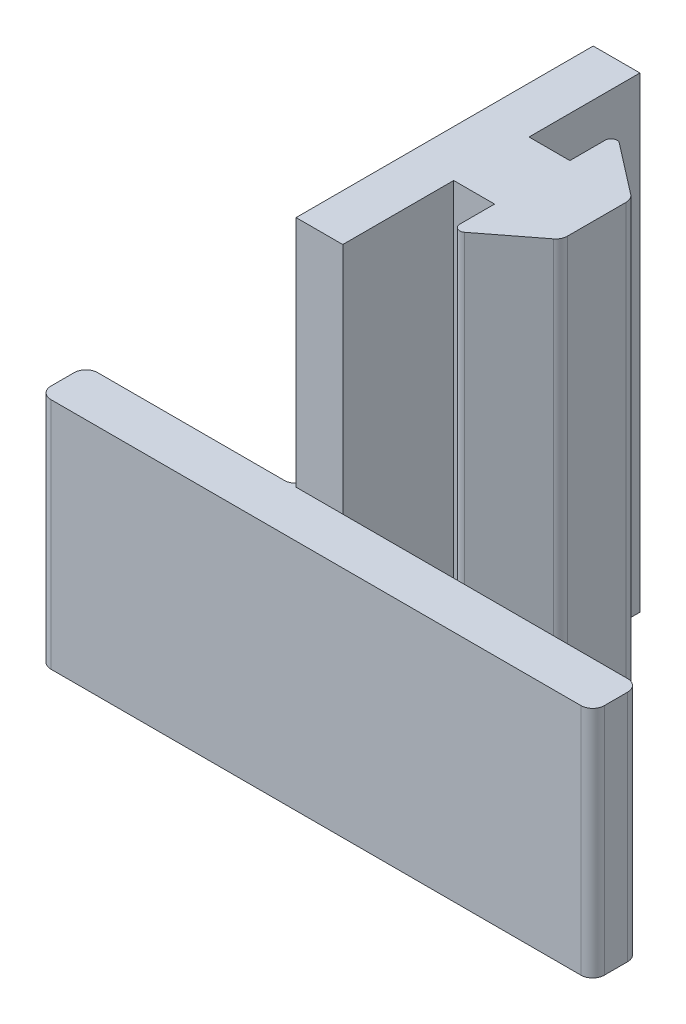
ISO-10303-21;
HEADER;
FILE_DESCRIPTION(('STEP AP214'),'2;1');
FILE_NAME('part.step','',(''),(''),'','','');
FILE_SCHEMA(('AUTOMOTIVE_DESIGN { 1 0 10303 214 1 1 1 1 }'));
ENDSEC;
DATA;
#1=APPLICATION_CONTEXT('core data for automotive mechanical design processes');
#2=APPLICATION_PROTOCOL_DEFINITION('international standard','automotive_design',2000,#1);
#3=PRODUCT_CONTEXT('',#1,'mechanical');
#4=PRODUCT('Part','Part','',(#3));
#5=PRODUCT_RELATED_PRODUCT_CATEGORY('part','',(#4));
#6=PRODUCT_DEFINITION_FORMATION('','',#4);
#7=PRODUCT_DEFINITION_CONTEXT('part definition',#1,'design');
#8=PRODUCT_DEFINITION('design','',#6,#7);
#9=PRODUCT_DEFINITION_SHAPE('','',#8);
#10=(LENGTH_UNIT() NAMED_UNIT(*) SI_UNIT(.MILLI.,.METRE.));
#11=(NAMED_UNIT(*) PLANE_ANGLE_UNIT() SI_UNIT($,.RADIAN.));
#12=(NAMED_UNIT(*) SI_UNIT($,.STERADIAN.) SOLID_ANGLE_UNIT());
#13=UNCERTAINTY_MEASURE_WITH_UNIT(LENGTH_MEASURE(1.E-05),#10,'distance_accuracy_value','');
#14=(GEOMETRIC_REPRESENTATION_CONTEXT(3) GLOBAL_UNCERTAINTY_ASSIGNED_CONTEXT((#13)) GLOBAL_UNIT_ASSIGNED_CONTEXT((#10,
#11,#12)) REPRESENTATION_CONTEXT('',''));
#15=CARTESIAN_POINT('',(0.,0.,0.));
#16=DIRECTION('',(0.,0.,1.));
#17=DIRECTION('',(1.,0.,0.));
#18=AXIS2_PLACEMENT_3D('',#15,#16,#17);
#19=CARTESIAN_POINT('',(7.,40.,-19.6412938457811));
#20=DIRECTION('',(0.,1.,0.));
#21=DIRECTION('',(0.,0.,1.));
#22=AXIS2_PLACEMENT_3D('',#19,#20,#21);
#23=PLANE('',#22);
#24=DIRECTION('',(0.,0.,1.));
#25=VECTOR('',#24,1.);
#26=CARTESIAN_POINT('',(-1.,40.,-0.65954106280193));
#27=LINE('',#26,#25);
#28=CARTESIAN_POINT('',(-1.,40.,-26.1095410628019));
#29=VERTEX_POINT('',#28);
#30=CARTESIAN_POINT('',(-1.,40.,-0.659541062801933));
#31=VERTEX_POINT('',#30);
#32=EDGE_CURVE('E229',#29,#31,#27,.T.);
#33=ORIENTED_EDGE('',*,*,#32,.T.);
#34=DIRECTION('',(1.,0.,0.));
#35=VECTOR('',#34,1.);
#36=CARTESIAN_POINT('',(7.,40.,-0.659541062801933));
#37=LINE('',#36,#35);
#38=CARTESIAN_POINT('',(3.,40.,-0.659541062801933));
#39=VERTEX_POINT('',#38);
#40=EDGE_CURVE('E215',#31,#39,#37,.T.);
#41=ORIENTED_EDGE('',*,*,#40,.T.);
#42=DIRECTION('',(0.,0.,-1.));
#43=VECTOR('',#42,1.);
#44=CARTESIAN_POINT('',(3.,40.,-0.659541062801933));
#45=LINE('',#44,#43);
#46=CARTESIAN_POINT('',(3.,40.,-10.1595410628019));
#47=VERTEX_POINT('',#46);
#48=EDGE_CURVE('E437',#39,#47,#45,.T.);
#49=ORIENTED_EDGE('',*,*,#48,.T.);
#50=DIRECTION('',(1.,0.,0.));
#51=VECTOR('',#50,1.);
#52=CARTESIAN_POINT('',(3.,40.,-10.1595410628019));
#53=LINE('',#52,#51);
#54=CARTESIAN_POINT('',(6.5,40.,-10.1595410628019));
#55=VERTEX_POINT('',#54);
#56=EDGE_CURVE('E442',#47,#55,#53,.T.);
#57=ORIENTED_EDGE('',*,*,#56,.T.);
#58=DIRECTION('',(0.,0.,1.));
#59=VECTOR('',#58,1.);
#60=CARTESIAN_POINT('',(6.5,40.,-10.1595410628019));
#61=LINE('',#60,#59);
#62=CARTESIAN_POINT('',(6.5,40.,-7.17778827982276));
#63=VERTEX_POINT('',#62);
#64=EDGE_CURVE('E445',#55,#63,#61,.T.);
#65=ORIENTED_EDGE('',*,*,#64,.T.);
#66=CARTESIAN_POINT('',(7.,40.,-7.17778827982275));
#67=DIRECTION('',(0.,1.,0.));
#68=DIRECTION('',(0.,0.,1.));
#69=AXIS2_PLACEMENT_3D('',#66,#67,#68);
#70=CIRCLE('',#69,0.5);
#71=CARTESIAN_POINT('',(7.30572375053789,40.,-6.78214577912667));
#72=VERTEX_POINT('',#71);
#73=EDGE_CURVE('E453',#63,#72,#70,.T.);
#74=ORIENTED_EDGE('',*,*,#73,.T.);
#75=DIRECTION('',(0.791285001392167,0.,-0.611447501075766));
#76=VECTOR('',#75,1.);
#77=CARTESIAN_POINT('',(7.30572375053789,40.,-6.78214577912667));
#78=LINE('',#77,#76);
#79=CARTESIAN_POINT('',(11.6114475010758,40.,-10.1092959499968));
#80=VERTEX_POINT('',#79);
#81=EDGE_CURVE('E456',#72,#80,#78,.T.);
#82=ORIENTED_EDGE('',*,*,#81,.T.);
#83=CARTESIAN_POINT('',(11.,40.,-10.900580951389));
#84=DIRECTION('',(0.,1.,0.));
#85=DIRECTION('',(0.,0.,1.));
#86=AXIS2_PLACEMENT_3D('',#83,#84,#85);
#87=CIRCLE('',#86,1.);
#88=CARTESIAN_POINT('',(12.,40.,-10.900580951389));
#89=VERTEX_POINT('',#88);
#90=EDGE_CURVE('E459',#80,#89,#87,.T.);
#91=ORIENTED_EDGE('',*,*,#90,.T.);
#92=DIRECTION('',(0.,0.,-1.));
#93=VECTOR('',#92,1.);
#94=CARTESIAN_POINT('',(12.,40.,-15.9185011742148));
#95=LINE('',#94,#93);
#96=CARTESIAN_POINT('',(12.,40.,-15.9185011742148));
#97=VERTEX_POINT('',#96);
#98=EDGE_CURVE('E462',#89,#97,#95,.T.);
#99=ORIENTED_EDGE('',*,*,#98,.T.);
#100=CARTESIAN_POINT('',(11.,40.,-15.9185011742149));
#101=DIRECTION('',(0.,1.,0.));
#102=DIRECTION('',(0.,0.,-1.));
#103=AXIS2_PLACEMENT_3D('',#100,#101,#102);
#104=CIRCLE('',#103,1.);
#105=CARTESIAN_POINT('',(11.6114475010758,40.,-16.709786175607));
#106=VERTEX_POINT('',#105);
#107=EDGE_CURVE('E465',#97,#106,#104,.T.);
#108=ORIENTED_EDGE('',*,*,#107,.T.);
#109=DIRECTION('',(-0.791285001392167,0.,-0.611447501075766));
#110=VECTOR('',#109,1.);
#111=CARTESIAN_POINT('',(7.30572375053789,40.,-20.0369363464772));
#112=LINE('',#111,#110);
#113=CARTESIAN_POINT('',(7.30572375053789,40.,-20.0369363464772));
#114=VERTEX_POINT('',#113);
#115=EDGE_CURVE('E468',#106,#114,#112,.T.);
#116=ORIENTED_EDGE('',*,*,#115,.T.);
#117=CARTESIAN_POINT('',(7.,40.,-19.6412938457811));
#118=DIRECTION('',(0.,1.,0.));
#119=DIRECTION('',(0.,0.,1.));
#120=AXIS2_PLACEMENT_3D('',#117,#118,#119);
#121=CIRCLE('',#120,0.5);
#122=CARTESIAN_POINT('',(6.5,40.,-19.6412938457811));
#123=VERTEX_POINT('',#122);
#124=EDGE_CURVE('E471',#114,#123,#121,.T.);
#125=ORIENTED_EDGE('',*,*,#124,.T.);
#126=DIRECTION('',(0.,0.,1.));
#127=VECTOR('',#126,1.);
#128=CARTESIAN_POINT('',(6.5,40.,-19.6412938457811));
#129=LINE('',#128,#127);
#130=CARTESIAN_POINT('',(6.5,40.,-16.6095410628019));
#131=VERTEX_POINT('',#130);
#132=EDGE_CURVE('E474',#123,#131,#129,.T.);
#133=ORIENTED_EDGE('',*,*,#132,.T.);
#134=DIRECTION('',(-1.,0.,0.));
#135=VECTOR('',#134,1.);
#136=CARTESIAN_POINT('',(3.,40.,-16.6095410628019));
#137=LINE('',#136,#135);
#138=CARTESIAN_POINT('',(3.,40.,-16.6095410628019));
#139=VERTEX_POINT('',#138);
#140=EDGE_CURVE('E477',#131,#139,#137,.T.);
#141=ORIENTED_EDGE('',*,*,#140,.T.);
#142=DIRECTION('',(0.,0.,-1.));
#143=VECTOR('',#142,1.);
#144=CARTESIAN_POINT('',(3.,40.,-16.6095410628019));
#145=LINE('',#144,#143);
#146=CARTESIAN_POINT('',(3.,40.,-26.1095410628019));
#147=VERTEX_POINT('',#146);
#148=EDGE_CURVE('E480',#139,#147,#145,.T.);
#149=ORIENTED_EDGE('',*,*,#148,.T.);
#150=DIRECTION('',(-1.,0.,0.));
#151=VECTOR('',#150,1.);
#152=CARTESIAN_POINT('',(-1.,40.,-26.1095410628019));
#153=LINE('',#152,#151);
#154=EDGE_CURVE('E231',#147,#29,#153,.T.);
#155=ORIENTED_EDGE('',*,*,#154,.T.);
#156=EDGE_LOOP('',(#33,#41,#49,#57,#65,#74,#82,#91,#99,#108,#116,#125,#133,#141,#149,#155));
#157=FACE_BOUND('',#156,.T.);
#158=ADVANCED_FACE('F39',(#157),#23,.T.);
#159=CARTESIAN_POINT('',(28.4,40.,-0.659541062801933));
#160=DIRECTION('',(-1.,0.,0.));
#161=DIRECTION('',(0.,0.,1.));
#162=AXIS2_PLACEMENT_3D('',#159,#160,#161);
#163=PLANE('',#162);
#164=DIRECTION('',(0.,0.,-1.));
#165=VECTOR('',#164,1.);
#166=CARTESIAN_POINT('',(28.4,0.,-0.659541062801933));
#167=LINE('',#166,#165);
#168=CARTESIAN_POINT('',(28.4,0.,2.34045893719807));
#169=VERTEX_POINT('',#168);
#170=CARTESIAN_POINT('',(28.4,0.,0.340458937198068));
#171=VERTEX_POINT('',#170);
#172=EDGE_CURVE('E388',#169,#171,#167,.T.);
#173=ORIENTED_EDGE('',*,*,#172,.T.);
#174=DIRECTION('',(0.,-1.,0.));
#175=VECTOR('',#174,1.);
#176=CARTESIAN_POINT('',(28.4,40.,0.340458937198068));
#177=LINE('',#176,#175);
#178=CARTESIAN_POINT('',(28.4,20.,0.340458937198068));
#179=VERTEX_POINT('',#178);
#180=EDGE_CURVE('E339',#171,#179,#177,.F.);
#181=ORIENTED_EDGE('',*,*,#180,.T.);
#182=DIRECTION('',(0.,0.,1.));
#183=VECTOR('',#182,1.);
#184=CARTESIAN_POINT('',(28.4,20.,-0.659541062801933));
#185=LINE('',#184,#183);
#186=CARTESIAN_POINT('',(28.4,20.,2.34045893719807));
#187=VERTEX_POINT('',#186);
#188=EDGE_CURVE('E486',#179,#187,#185,.T.);
#189=ORIENTED_EDGE('',*,*,#188,.T.);
#190=DIRECTION('',(0.,-1.,0.));
#191=VECTOR('',#190,1.);
#192=CARTESIAN_POINT('',(28.4,40.,2.34045893719807));
#193=LINE('',#192,#191);
#194=EDGE_CURVE('E335',#187,#169,#193,.T.);
#195=ORIENTED_EDGE('',*,*,#194,.T.);
#196=EDGE_LOOP('',(#173,#181,#189,#195));
#197=FACE_BOUND('',#196,.T.);
#198=ADVANCED_FACE('F518',(#197),#163,.F.);
#199=CARTESIAN_POINT('',(3.,40.,-0.659541062801933));
#200=DIRECTION('',(0.,0.,1.));
#201=DIRECTION('',(1.,0.,0.));
#202=AXIS2_PLACEMENT_3D('',#199,#200,#201);
#203=PLANE('',#202);
#204=DIRECTION('',(1.,0.,0.));
#205=VECTOR('',#204,1.);
#206=CARTESIAN_POINT('',(-19.,20.,-0.659541062801933));
#207=LINE('',#206,#205);
#208=CARTESIAN_POINT('',(3.,20.,-0.659541062801933));
#209=VERTEX_POINT('',#208);
#210=CARTESIAN_POINT('',(27.4,20.,-0.659541062801933));
#211=VERTEX_POINT('',#210);
#212=EDGE_CURVE('E501',#209,#211,#207,.T.);
#213=ORIENTED_EDGE('',*,*,#212,.T.);
#214=DIRECTION('',(0.,-1.,0.));
#215=VECTOR('',#214,1.);
#216=CARTESIAN_POINT('',(27.4,40.,-0.659541062801933));
#217=LINE('',#216,#215);
#218=CARTESIAN_POINT('',(27.4,0.,-0.659541062801933));
#219=VERTEX_POINT('',#218);
#220=EDGE_CURVE('E331',#211,#219,#217,.T.);
#221=ORIENTED_EDGE('',*,*,#220,.T.);
#222=DIRECTION('',(-1.,0.,0.));
#223=VECTOR('',#222,1.);
#224=CARTESIAN_POINT('',(3.,0.,-0.659541062801933));
#225=LINE('',#224,#223);
#226=CARTESIAN_POINT('',(3.,0.,-0.659541062801933));
#227=VERTEX_POINT('',#226);
#228=EDGE_CURVE('E379',#219,#227,#225,.T.);
#229=ORIENTED_EDGE('',*,*,#228,.T.);
#230=DIRECTION('',(0.,-1.,0.));
#231=VECTOR('',#230,1.);
#232=CARTESIAN_POINT('',(3.,40.,-0.659541062801933));
#233=LINE('',#232,#231);
#234=EDGE_CURVE('E299',#209,#227,#233,.T.);
#235=ORIENTED_EDGE('',*,*,#234,.F.);
#236=EDGE_LOOP('',(#213,#221,#229,#235));
#237=FACE_BOUND('',#236,.T.);
#238=ADVANCED_FACE('F511',(#237),#203,.F.);
#239=CARTESIAN_POINT('',(3.,40.,-0.659541062801933));
#240=DIRECTION('',(-1.,0.,0.));
#241=DIRECTION('',(0.,0.,1.));
#242=AXIS2_PLACEMENT_3D('',#239,#240,#241);
#243=PLANE('',#242);
#244=DIRECTION('',(0.,0.,-1.));
#245=VECTOR('',#244,1.);
#246=CARTESIAN_POINT('',(3.,0.,-0.659541062801933));
#247=LINE('',#246,#245);
#248=CARTESIAN_POINT('',(3.,0.,-10.1595410628019));
#249=VERTEX_POINT('',#248);
#250=EDGE_CURVE('E372',#227,#249,#247,.T.);
#251=ORIENTED_EDGE('',*,*,#250,.T.);
#252=DIRECTION('',(0.,-1.,0.));
#253=VECTOR('',#252,1.);
#254=CARTESIAN_POINT('',(3.,40.,-10.1595410628019));
#255=LINE('',#254,#253);
#256=EDGE_CURVE('E295',#47,#249,#255,.T.);
#257=ORIENTED_EDGE('',*,*,#256,.F.);
#258=ORIENTED_EDGE('',*,*,#48,.F.);
#259=EDGE_CURVE('E222',#39,#209,#233,.T.);
#260=ORIENTED_EDGE('',*,*,#259,.T.);
#261=ORIENTED_EDGE('',*,*,#234,.T.);
#262=EDGE_LOOP('',(#251,#257,#258,#260,#261));
#263=FACE_BOUND('',#262,.T.);
#264=ADVANCED_FACE('F370',(#263),#243,.F.);
#265=CARTESIAN_POINT('',(3.,40.,-10.1595410628019));
#266=DIRECTION('',(0.,0.,-1.));
#267=DIRECTION('',(-1.,0.,0.));
#268=AXIS2_PLACEMENT_3D('',#265,#266,#267);
#269=PLANE('',#268);
#270=DIRECTION('',(1.,0.,0.));
#271=VECTOR('',#270,1.);
#272=CARTESIAN_POINT('',(3.,0.,-10.1595410628019));
#273=LINE('',#272,#271);
#274=CARTESIAN_POINT('',(6.5,0.,-10.1595410628019));
#275=VERTEX_POINT('',#274);
#276=EDGE_CURVE('E381',#249,#275,#273,.T.);
#277=ORIENTED_EDGE('',*,*,#276,.T.);
#278=DIRECTION('',(0.,-1.,0.));
#279=VECTOR('',#278,1.);
#280=CARTESIAN_POINT('',(6.5,40.,-10.1595410628019));
#281=LINE('',#280,#279);
#282=EDGE_CURVE('E291',#55,#275,#281,.T.);
#283=ORIENTED_EDGE('',*,*,#282,.F.);
#284=ORIENTED_EDGE('',*,*,#56,.F.);
#285=ORIENTED_EDGE('',*,*,#256,.T.);
#286=EDGE_LOOP('',(#277,#283,#284,#285));
#287=FACE_BOUND('',#286,.T.);
#288=ADVANCED_FACE('F615',(#287),#269,.F.);
#289=CARTESIAN_POINT('',(6.5,40.,-10.1595410628019));
#290=DIRECTION('',(1.,0.,0.));
#291=DIRECTION('',(0.,0.,-1.));
#292=AXIS2_PLACEMENT_3D('',#289,#290,#291);
#293=PLANE('',#292);
#294=DIRECTION('',(0.,0.,1.));
#295=VECTOR('',#294,1.);
#296=CARTESIAN_POINT('',(6.5,0.,-10.1595410628019));
#297=LINE('',#296,#295);
#298=CARTESIAN_POINT('',(6.5,0.,-7.17778827982276));
#299=VERTEX_POINT('',#298);
#300=EDGE_CURVE('E386',#275,#299,#297,.T.);
#301=ORIENTED_EDGE('',*,*,#300,.T.);
#302=DIRECTION('',(0.,-1.,0.));
#303=VECTOR('',#302,1.);
#304=CARTESIAN_POINT('',(6.5,40.,-7.17778827982276));
#305=LINE('',#304,#303);
#306=EDGE_CURVE('E287',#63,#299,#305,.T.);
#307=ORIENTED_EDGE('',*,*,#306,.F.);
#308=ORIENTED_EDGE('',*,*,#64,.F.);
#309=ORIENTED_EDGE('',*,*,#282,.T.);
#310=EDGE_LOOP('',(#301,#307,#308,#309));
#311=FACE_BOUND('',#310,.T.);
#312=ADVANCED_FACE('F611',(#311),#293,.F.);
#313=CARTESIAN_POINT('',(7.,40.,-7.17778827982275));
#314=DIRECTION('',(0.,-1.,0.));
#315=DIRECTION('',(0.,0.,-1.));
#316=AXIS2_PLACEMENT_3D('',#313,#314,#315);
#317=CYLINDRICAL_SURFACE('',#316,0.5);
#318=CARTESIAN_POINT('',(7.,0.,-7.17778827982275));
#319=DIRECTION('',(0.,1.,0.));
#320=DIRECTION('',(0.,0.,1.));
#321=AXIS2_PLACEMENT_3D('',#318,#319,#320);
#322=CIRCLE('',#321,0.5);
#323=CARTESIAN_POINT('',(7.30572375053789,0.,-6.78214577912667));
#324=VERTEX_POINT('',#323);
#325=EDGE_CURVE('E394',#299,#324,#322,.T.);
#326=ORIENTED_EDGE('',*,*,#325,.T.);
#327=DIRECTION('',(0.,-1.,0.));
#328=VECTOR('',#327,1.);
#329=CARTESIAN_POINT('',(7.30572375053789,40.,-6.78214577912667));
#330=LINE('',#329,#328);
#331=EDGE_CURVE('E283',#72,#324,#330,.T.);
#332=ORIENTED_EDGE('',*,*,#331,.F.);
#333=ORIENTED_EDGE('',*,*,#73,.F.);
#334=ORIENTED_EDGE('',*,*,#306,.T.);
#335=EDGE_LOOP('',(#326,#332,#333,#334));
#336=FACE_BOUND('',#335,.T.);
#337=ADVANCED_FACE('F607',(#336),#317,.T.);
#338=CARTESIAN_POINT('',(7.30572375053789,40.,-6.78214577912667));
#339=DIRECTION('',(-0.611447501075766,0.,-0.791285001392167));
#340=DIRECTION('',(-0.791285001392167,0.,0.611447501075766));
#341=AXIS2_PLACEMENT_3D('',#338,#339,#340);
#342=PLANE('',#341);
#343=DIRECTION('',(0.791285001392167,0.,-0.611447501075766));
#344=VECTOR('',#343,1.);
#345=CARTESIAN_POINT('',(7.30572375053789,0.,-6.78214577912667));
#346=LINE('',#345,#344);
#347=CARTESIAN_POINT('',(11.6114475010758,0.,-10.1092959499968));
#348=VERTEX_POINT('',#347);
#349=EDGE_CURVE('E397',#324,#348,#346,.T.);
#350=ORIENTED_EDGE('',*,*,#349,.T.);
#351=DIRECTION('',(0.,-1.,0.));
#352=VECTOR('',#351,1.);
#353=CARTESIAN_POINT('',(11.6114475010758,40.,-10.1092959499968));
#354=LINE('',#353,#352);
#355=EDGE_CURVE('E279',#80,#348,#354,.T.);
#356=ORIENTED_EDGE('',*,*,#355,.F.);
#357=ORIENTED_EDGE('',*,*,#81,.F.);
#358=ORIENTED_EDGE('',*,*,#331,.T.);
#359=EDGE_LOOP('',(#350,#356,#357,#358));
#360=FACE_BOUND('',#359,.T.);
#361=ADVANCED_FACE('F603',(#360),#342,.F.);
#362=CARTESIAN_POINT('',(11.,40.,-10.900580951389));
#363=DIRECTION('',(0.,-1.,0.));
#364=DIRECTION('',(0.,0.,-1.));
#365=AXIS2_PLACEMENT_3D('',#362,#363,#364);
#366=CYLINDRICAL_SURFACE('',#365,1.);
#367=CARTESIAN_POINT('',(11.,0.,-10.900580951389));
#368=DIRECTION('',(0.,1.,0.));
#369=DIRECTION('',(0.,0.,1.));
#370=AXIS2_PLACEMENT_3D('',#367,#368,#369);
#371=CIRCLE('',#370,1.);
#372=CARTESIAN_POINT('',(12.,0.,-10.900580951389));
#373=VERTEX_POINT('',#372);
#374=EDGE_CURVE('E400',#348,#373,#371,.T.);
#375=ORIENTED_EDGE('',*,*,#374,.T.);
#376=DIRECTION('',(0.,-1.,0.));
#377=VECTOR('',#376,1.);
#378=CARTESIAN_POINT('',(12.,40.,-10.900580951389));
#379=LINE('',#378,#377);
#380=EDGE_CURVE('E275',#89,#373,#379,.T.);
#381=ORIENTED_EDGE('',*,*,#380,.F.);
#382=ORIENTED_EDGE('',*,*,#90,.F.);
#383=ORIENTED_EDGE('',*,*,#355,.T.);
#384=EDGE_LOOP('',(#375,#381,#382,#383));
#385=FACE_BOUND('',#384,.T.);
#386=ADVANCED_FACE('F599',(#385),#366,.T.);
#387=CARTESIAN_POINT('',(12.,40.,-15.9185011742148));
#388=DIRECTION('',(-1.,0.,0.));
#389=DIRECTION('',(0.,0.,1.));
#390=AXIS2_PLACEMENT_3D('',#387,#388,#389);
#391=PLANE('',#390);
#392=DIRECTION('',(0.,0.,-1.));
#393=VECTOR('',#392,1.);
#394=CARTESIAN_POINT('',(12.,0.,-15.9185011742148));
#395=LINE('',#394,#393);
#396=CARTESIAN_POINT('',(12.,0.,-15.9185011742148));
#397=VERTEX_POINT('',#396);
#398=EDGE_CURVE('E403',#373,#397,#395,.T.);
#399=ORIENTED_EDGE('',*,*,#398,.T.);
#400=DIRECTION('',(0.,-1.,0.));
#401=VECTOR('',#400,1.);
#402=CARTESIAN_POINT('',(12.,40.,-15.9185011742148));
#403=LINE('',#402,#401);
#404=EDGE_CURVE('E271',#97,#397,#403,.T.);
#405=ORIENTED_EDGE('',*,*,#404,.F.);
#406=ORIENTED_EDGE('',*,*,#98,.F.);
#407=ORIENTED_EDGE('',*,*,#380,.T.);
#408=EDGE_LOOP('',(#399,#405,#406,#407));
#409=FACE_BOUND('',#408,.T.);
#410=ADVANCED_FACE('F595',(#409),#391,.F.);
#411=CARTESIAN_POINT('',(11.,40.,-15.9185011742149));
#412=DIRECTION('',(0.,-1.,0.));
#413=DIRECTION('',(0.,0.,-1.));
#414=AXIS2_PLACEMENT_3D('',#411,#412,#413);
#415=CYLINDRICAL_SURFACE('',#414,1.);
#416=CARTESIAN_POINT('',(11.,0.,-15.9185011742149));
#417=DIRECTION('',(0.,1.,0.));
#418=DIRECTION('',(0.,0.,-1.));
#419=AXIS2_PLACEMENT_3D('',#416,#417,#418);
#420=CIRCLE('',#419,1.);
#421=CARTESIAN_POINT('',(11.6114475010758,0.,-16.709786175607));
#422=VERTEX_POINT('',#421);
#423=EDGE_CURVE('E406',#397,#422,#420,.T.);
#424=ORIENTED_EDGE('',*,*,#423,.T.);
#425=DIRECTION('',(0.,-1.,0.));
#426=VECTOR('',#425,1.);
#427=CARTESIAN_POINT('',(11.6114475010758,40.,-16.709786175607));
#428=LINE('',#427,#426);
#429=EDGE_CURVE('E267',#106,#422,#428,.T.);
#430=ORIENTED_EDGE('',*,*,#429,.F.);
#431=ORIENTED_EDGE('',*,*,#107,.F.);
#432=ORIENTED_EDGE('',*,*,#404,.T.);
#433=EDGE_LOOP('',(#424,#430,#431,#432));
#434=FACE_BOUND('',#433,.T.);
#435=ADVANCED_FACE('F591',(#434),#415,.T.);
#436=CARTESIAN_POINT('',(7.30572375053789,40.,-20.0369363464772));
#437=DIRECTION('',(-0.611447501075766,0.,0.791285001392167));
#438=DIRECTION('',(0.791285001392167,0.,0.611447501075766));
#439=AXIS2_PLACEMENT_3D('',#436,#437,#438);
#440=PLANE('',#439);
#441=DIRECTION('',(-0.791285001392167,0.,-0.611447501075766));
#442=VECTOR('',#441,1.);
#443=CARTESIAN_POINT('',(7.30572375053789,0.,-20.0369363464772));
#444=LINE('',#443,#442);
#445=CARTESIAN_POINT('',(7.30572375053789,0.,-20.0369363464772));
#446=VERTEX_POINT('',#445);
#447=EDGE_CURVE('E409',#422,#446,#444,.T.);
#448=ORIENTED_EDGE('',*,*,#447,.T.);
#449=DIRECTION('',(0.,-1.,0.));
#450=VECTOR('',#449,1.);
#451=CARTESIAN_POINT('',(7.30572375053789,40.,-20.0369363464772));
#452=LINE('',#451,#450);
#453=EDGE_CURVE('E263',#114,#446,#452,.T.);
#454=ORIENTED_EDGE('',*,*,#453,.F.);
#455=ORIENTED_EDGE('',*,*,#115,.F.);
#456=ORIENTED_EDGE('',*,*,#429,.T.);
#457=EDGE_LOOP('',(#448,#454,#455,#456));
#458=FACE_BOUND('',#457,.T.);
#459=ADVANCED_FACE('F587',(#458),#440,.F.);
#460=CARTESIAN_POINT('',(7.,40.,-19.6412938457811));
#461=DIRECTION('',(0.,-1.,0.));
#462=DIRECTION('',(0.,0.,-1.));
#463=AXIS2_PLACEMENT_3D('',#460,#461,#462);
#464=CYLINDRICAL_SURFACE('',#463,0.5);
#465=CARTESIAN_POINT('',(7.,0.,-19.6412938457811));
#466=DIRECTION('',(0.,1.,0.));
#467=DIRECTION('',(0.,0.,1.));
#468=AXIS2_PLACEMENT_3D('',#465,#466,#467);
#469=CIRCLE('',#468,0.5);
#470=CARTESIAN_POINT('',(6.5,0.,-19.6412938457811));
#471=VERTEX_POINT('',#470);
#472=EDGE_CURVE('E412',#446,#471,#469,.T.);
#473=ORIENTED_EDGE('',*,*,#472,.T.);
#474=DIRECTION('',(0.,-1.,0.));
#475=VECTOR('',#474,1.);
#476=CARTESIAN_POINT('',(6.5,40.,-19.6412938457811));
#477=LINE('',#476,#475);
#478=EDGE_CURVE('E259',#123,#471,#477,.T.);
#479=ORIENTED_EDGE('',*,*,#478,.F.);
#480=ORIENTED_EDGE('',*,*,#124,.F.);
#481=ORIENTED_EDGE('',*,*,#453,.T.);
#482=EDGE_LOOP('',(#473,#479,#480,#481));
#483=FACE_BOUND('',#482,.T.);
#484=ADVANCED_FACE('F583',(#483),#464,.T.);
#485=CARTESIAN_POINT('',(6.5,40.,-19.6412938457811));
#486=DIRECTION('',(1.,0.,0.));
#487=DIRECTION('',(0.,0.,-1.));
#488=AXIS2_PLACEMENT_3D('',#485,#486,#487);
#489=PLANE('',#488);
#490=DIRECTION('',(0.,0.,1.));
#491=VECTOR('',#490,1.);
#492=CARTESIAN_POINT('',(6.5,0.,-19.6412938457811));
#493=LINE('',#492,#491);
#494=CARTESIAN_POINT('',(6.5,0.,-16.6095410628019));
#495=VERTEX_POINT('',#494);
#496=EDGE_CURVE('E415',#471,#495,#493,.T.);
#497=ORIENTED_EDGE('',*,*,#496,.T.);
#498=DIRECTION('',(0.,-1.,0.));
#499=VECTOR('',#498,1.);
#500=CARTESIAN_POINT('',(6.5,40.,-16.6095410628019));
#501=LINE('',#500,#499);
#502=EDGE_CURVE('E255',#131,#495,#501,.T.);
#503=ORIENTED_EDGE('',*,*,#502,.F.);
#504=ORIENTED_EDGE('',*,*,#132,.F.);
#505=ORIENTED_EDGE('',*,*,#478,.T.);
#506=EDGE_LOOP('',(#497,#503,#504,#505));
#507=FACE_BOUND('',#506,.T.);
#508=ADVANCED_FACE('F579',(#507),#489,.F.);
#509=CARTESIAN_POINT('',(3.,40.,-16.6095410628019));
#510=DIRECTION('',(0.,0.,1.));
#511=DIRECTION('',(1.,0.,0.));
#512=AXIS2_PLACEMENT_3D('',#509,#510,#511);
#513=PLANE('',#512);
#514=DIRECTION('',(-1.,0.,0.));
#515=VECTOR('',#514,1.);
#516=CARTESIAN_POINT('',(3.,0.,-16.6095410628019));
#517=LINE('',#516,#515);
#518=CARTESIAN_POINT('',(3.,0.,-16.6095410628019));
#519=VERTEX_POINT('',#518);
#520=EDGE_CURVE('E418',#495,#519,#517,.T.);
#521=ORIENTED_EDGE('',*,*,#520,.T.);
#522=DIRECTION('',(0.,-1.,0.));
#523=VECTOR('',#522,1.);
#524=CARTESIAN_POINT('',(3.,40.,-16.6095410628019));
#525=LINE('',#524,#523);
#526=EDGE_CURVE('E251',#139,#519,#525,.T.);
#527=ORIENTED_EDGE('',*,*,#526,.F.);
#528=ORIENTED_EDGE('',*,*,#140,.F.);
#529=ORIENTED_EDGE('',*,*,#502,.T.);
#530=EDGE_LOOP('',(#521,#527,#528,#529));
#531=FACE_BOUND('',#530,.T.);
#532=ADVANCED_FACE('F575',(#531),#513,.F.);
#533=CARTESIAN_POINT('',(3.,40.,-16.6095410628019));
#534=DIRECTION('',(-1.,0.,0.));
#535=DIRECTION('',(0.,0.,1.));
#536=AXIS2_PLACEMENT_3D('',#533,#534,#535);
#537=PLANE('',#536);
#538=DIRECTION('',(0.,0.,-1.));
#539=VECTOR('',#538,1.);
#540=CARTESIAN_POINT('',(3.,0.,-16.6095410628019));
#541=LINE('',#540,#539);
#542=CARTESIAN_POINT('',(3.,0.,-26.1095410628019));
#543=VERTEX_POINT('',#542);
#544=EDGE_CURVE('E421',#519,#543,#541,.T.);
#545=ORIENTED_EDGE('',*,*,#544,.T.);
#546=DIRECTION('',(0.,-1.,0.));
#547=VECTOR('',#546,1.);
#548=CARTESIAN_POINT('',(3.,40.,-26.1095410628019));
#549=LINE('',#548,#547);
#550=EDGE_CURVE('E242',#147,#543,#549,.T.);
#551=ORIENTED_EDGE('',*,*,#550,.F.);
#552=ORIENTED_EDGE('',*,*,#148,.F.);
#553=ORIENTED_EDGE('',*,*,#526,.T.);
#554=EDGE_LOOP('',(#545,#551,#552,#553));
#555=FACE_BOUND('',#554,.T.);
#556=ADVANCED_FACE('F571',(#555),#537,.F.);
#557=CARTESIAN_POINT('',(-1.,40.,-26.1095410628019));
#558=DIRECTION('',(0.,0.,1.));
#559=DIRECTION('',(1.,0.,0.));
#560=AXIS2_PLACEMENT_3D('',#557,#558,#559);
#561=PLANE('',#560);
#562=DIRECTION('',(-1.,0.,0.));
#563=VECTOR('',#562,1.);
#564=CARTESIAN_POINT('',(-1.,0.,-26.1095410628019));
#565=LINE('',#564,#563);
#566=CARTESIAN_POINT('',(-1.,0.,-26.1095410628019));
#567=VERTEX_POINT('',#566);
#568=EDGE_CURVE('E424',#543,#567,#565,.T.);
#569=ORIENTED_EDGE('',*,*,#568,.T.);
#570=DIRECTION('',(0.,-1.,0.));
#571=VECTOR('',#570,1.);
#572=CARTESIAN_POINT('',(-1.,40.,-26.1095410628019));
#573=LINE('',#572,#571);
#574=EDGE_CURVE('E239',#29,#567,#573,.T.);
#575=ORIENTED_EDGE('',*,*,#574,.F.);
#576=ORIENTED_EDGE('',*,*,#154,.F.);
#577=ORIENTED_EDGE('',*,*,#550,.T.);
#578=EDGE_LOOP('',(#569,#575,#576,#577));
#579=FACE_BOUND('',#578,.T.);
#580=ADVANCED_FACE('F568',(#579),#561,.F.);
#581=CARTESIAN_POINT('',(-1.,40.,-0.65954106280193));
#582=DIRECTION('',(1.,0.,0.));
#583=DIRECTION('',(0.,0.,-1.));
#584=AXIS2_PLACEMENT_3D('',#581,#582,#583);
#585=PLANE('',#584);
#586=DIRECTION('',(0.,0.,1.));
#587=VECTOR('',#586,1.);
#588=CARTESIAN_POINT('',(-1.,0.,-0.65954106280193));
#589=LINE('',#588,#587);
#590=CARTESIAN_POINT('',(-1.,0.,-1.65954106280193));
#591=VERTEX_POINT('',#590);
#592=EDGE_CURVE('E427',#567,#591,#589,.T.);
#593=ORIENTED_EDGE('',*,*,#592,.T.);
#594=DIRECTION('',(0.,-1.,0.));
#595=VECTOR('',#594,1.);
#596=CARTESIAN_POINT('',(-1.,20.,-1.65954106280193));
#597=LINE('',#596,#595);
#598=CARTESIAN_POINT('',(-1.,20.,-1.65954106280193));
#599=VERTEX_POINT('',#598);
#600=EDGE_CURVE('E362',#591,#599,#597,.F.);
#601=ORIENTED_EDGE('',*,*,#600,.T.);
#602=DIRECTION('',(0.,0.,1.));
#603=VECTOR('',#602,1.);
#604=CARTESIAN_POINT('',(-1.,20.,-0.659541062801933));
#605=LINE('',#604,#603);
#606=CARTESIAN_POINT('',(-1.,20.,-0.659541062801933));
#607=VERTEX_POINT('',#606);
#608=EDGE_CURVE('E54',#599,#607,#605,.T.);
#609=ORIENTED_EDGE('',*,*,#608,.T.);
#610=DIRECTION('',(0.,-1.,0.));
#611=VECTOR('',#610,1.);
#612=CARTESIAN_POINT('',(-1.,40.,-0.65954106280193));
#613=LINE('',#612,#611);
#614=EDGE_CURVE('E220',#31,#607,#613,.T.);
#615=ORIENTED_EDGE('',*,*,#614,.F.);
#616=ORIENTED_EDGE('',*,*,#32,.F.);
#617=ORIENTED_EDGE('',*,*,#574,.T.);
#618=EDGE_LOOP('',(#593,#601,#609,#615,#616,#617));
#619=FACE_BOUND('',#618,.T.);
#620=ADVANCED_FACE('F237',(#619),#585,.F.);
#621=CARTESIAN_POINT('',(-1.,40.,-0.65954106280193));
#622=DIRECTION('',(0.,0.,1.));
#623=DIRECTION('',(1.,0.,0.));
#624=AXIS2_PLACEMENT_3D('',#621,#622,#623);
#625=PLANE('',#624);
#626=CARTESIAN_POINT('',(-18.,20.,-0.659541062801933));
#627=VERTEX_POINT('',#626);
#628=CARTESIAN_POINT('',(-2.,20.,-0.659541062801933));
#629=VERTEX_POINT('',#628);
#630=EDGE_CURVE('E495',#627,#629,#207,.T.);
#631=ORIENTED_EDGE('',*,*,#630,.T.);
#632=DIRECTION('',(0.,-1.,0.));
#633=VECTOR('',#632,1.);
#634=CARTESIAN_POINT('',(-2.,0.,-0.659541062801929));
#635=LINE('',#634,#633);
#636=CARTESIAN_POINT('',(-2.,0.,-0.65954106280193));
#637=VERTEX_POINT('',#636);
#638=EDGE_CURVE('E356',#629,#637,#635,.T.);
#639=ORIENTED_EDGE('',*,*,#638,.T.);
#640=DIRECTION('',(-1.,0.,0.));
#641=VECTOR('',#640,1.);
#642=CARTESIAN_POINT('',(-1.,0.,-0.65954106280193));
#643=LINE('',#642,#641);
#644=CARTESIAN_POINT('',(-18.,0.,-0.659541062801928));
#645=VERTEX_POINT('',#644);
#646=EDGE_CURVE('E430',#637,#645,#643,.T.);
#647=ORIENTED_EDGE('',*,*,#646,.T.);
#648=DIRECTION('',(0.,-1.,0.));
#649=VECTOR('',#648,1.);
#650=CARTESIAN_POINT('',(-18.,40.,-0.659541062801928));
#651=LINE('',#650,#649);
#652=EDGE_CURVE('E350',#645,#627,#651,.F.);
#653=ORIENTED_EDGE('',*,*,#652,.T.);
#654=EDGE_LOOP('',(#631,#639,#647,#653));
#655=FACE_BOUND('',#654,.T.);
#656=ADVANCED_FACE('F561',(#655),#625,.F.);
#657=CARTESIAN_POINT('',(-19.,40.,-0.659541062801928));
#658=DIRECTION('',(1.,0.,0.));
#659=DIRECTION('',(0.,0.,-1.));
#660=AXIS2_PLACEMENT_3D('',#657,#658,#659);
#661=PLANE('',#660);
#662=DIRECTION('',(0.,0.,1.));
#663=VECTOR('',#662,1.);
#664=CARTESIAN_POINT('',(-19.,20.,-0.659541062801933));
#665=LINE('',#664,#663);
#666=CARTESIAN_POINT('',(-19.,20.,0.340458937198072));
#667=VERTEX_POINT('',#666);
#668=CARTESIAN_POINT('',(-19.,20.,2.34045893719807));
#669=VERTEX_POINT('',#668);
#670=EDGE_CURVE('E448',#667,#669,#665,.T.);
#671=ORIENTED_EDGE('',*,*,#670,.F.);
#672=DIRECTION('',(0.,-1.,0.));
#673=VECTOR('',#672,1.);
#674=CARTESIAN_POINT('',(-19.,40.,0.340458937198072));
#675=LINE('',#674,#673);
#676=CARTESIAN_POINT('',(-19.,0.,0.340458937198072));
#677=VERTEX_POINT('',#676);
#678=EDGE_CURVE('E342',#667,#677,#675,.T.);
#679=ORIENTED_EDGE('',*,*,#678,.T.);
#680=DIRECTION('',(0.,0.,1.));
#681=VECTOR('',#680,1.);
#682=CARTESIAN_POINT('',(-19.,0.,-0.659541062801928));
#683=LINE('',#682,#681);
#684=CARTESIAN_POINT('',(-19.,0.,2.34045893719807));
#685=VERTEX_POINT('',#684);
#686=EDGE_CURVE('E432',#677,#685,#683,.T.);
#687=ORIENTED_EDGE('',*,*,#686,.T.);
#688=DIRECTION('',(0.,-1.,0.));
#689=VECTOR('',#688,1.);
#690=CARTESIAN_POINT('',(-19.,40.,2.34045893719807));
#691=LINE('',#690,#689);
#692=EDGE_CURVE('E318',#685,#669,#691,.F.);
#693=ORIENTED_EDGE('',*,*,#692,.T.);
#694=EDGE_LOOP('',(#671,#679,#687,#693));
#695=FACE_BOUND('',#694,.T.);
#696=ADVANCED_FACE('F548',(#695),#661,.F.);
#697=CARTESIAN_POINT('',(-4.9999120167291,40.,3.34045893719807));
#698=DIRECTION('',(0.,0.,-1.));
#699=DIRECTION('',(-1.,0.,0.));
#700=AXIS2_PLACEMENT_3D('',#697,#698,#699);
#701=PLANE('',#700);
#702=DIRECTION('',(1.,0.,0.));
#703=VECTOR('',#702,1.);
#704=CARTESIAN_POINT('',(-19.,20.,3.34045893719807));
#705=LINE('',#704,#703);
#706=CARTESIAN_POINT('',(-18.,20.,3.34045893719807));
#707=VERTEX_POINT('',#706);
#708=CARTESIAN_POINT('',(27.4,20.,3.34045893719807));
#709=VERTEX_POINT('',#708);
#710=EDGE_CURVE('E497',#707,#709,#705,.T.);
#711=ORIENTED_EDGE('',*,*,#710,.F.);
#712=DIRECTION('',(0.,-1.,0.));
#713=VECTOR('',#712,1.);
#714=CARTESIAN_POINT('',(-18.,40.,3.34045893719807));
#715=LINE('',#714,#713);
#716=CARTESIAN_POINT('',(-18.,0.,3.34045893719807));
#717=VERTEX_POINT('',#716);
#718=EDGE_CURVE('E304',#707,#717,#715,.T.);
#719=ORIENTED_EDGE('',*,*,#718,.T.);
#720=DIRECTION('',(1.,0.,0.));
#721=VECTOR('',#720,1.);
#722=CARTESIAN_POINT('',(-4.9999120167291,0.,3.34045893719807));
#723=LINE('',#722,#721);
#724=CARTESIAN_POINT('',(27.4,0.,3.34045893719807));
#725=VERTEX_POINT('',#724);
#726=EDGE_CURVE('E245',#717,#725,#723,.T.);
#727=ORIENTED_EDGE('',*,*,#726,.T.);
#728=DIRECTION('',(0.,-1.,0.));
#729=VECTOR('',#728,1.);
#730=CARTESIAN_POINT('',(27.4,40.,3.34045893719807));
#731=LINE('',#730,#729);
#732=EDGE_CURVE('E226',#725,#709,#731,.F.);
#733=ORIENTED_EDGE('',*,*,#732,.T.);
#734=EDGE_LOOP('',(#711,#719,#727,#733));
#735=FACE_BOUND('',#734,.T.);
#736=ADVANCED_FACE('F553',(#735),#701,.F.);
#737=CARTESIAN_POINT('',(7.,0.,-19.6412938457811));
#738=DIRECTION('',(0.,1.,0.));
#739=DIRECTION('',(0.,0.,1.));
#740=AXIS2_PLACEMENT_3D('',#737,#738,#739);
#741=PLANE('',#740);
#742=ORIENTED_EDGE('',*,*,#686,.F.);
#743=CARTESIAN_POINT('',(-18.,0.,0.340458937198072));
#744=DIRECTION('',(0.,1.,0.));
#745=DIRECTION('',(0.,0.,1.));
#746=AXIS2_PLACEMENT_3D('',#743,#744,#745);
#747=CIRCLE('',#746,1.);
#748=EDGE_CURVE('E346',#677,#645,#747,.F.);
#749=ORIENTED_EDGE('',*,*,#748,.T.);
#750=ORIENTED_EDGE('',*,*,#646,.F.);
#751=CARTESIAN_POINT('',(-2.,0.,-1.65954106280193));
#752=DIRECTION('',(0.,1.,0.));
#753=DIRECTION('',(0.,0.,1.));
#754=AXIS2_PLACEMENT_3D('',#751,#752,#753);
#755=CIRCLE('',#754,1.);
#756=EDGE_CURVE('E48',#637,#591,#755,.T.);
#757=ORIENTED_EDGE('',*,*,#756,.T.);
#758=ORIENTED_EDGE('',*,*,#592,.F.);
#759=ORIENTED_EDGE('',*,*,#568,.F.);
#760=ORIENTED_EDGE('',*,*,#544,.F.);
#761=ORIENTED_EDGE('',*,*,#520,.F.);
#762=ORIENTED_EDGE('',*,*,#496,.F.);
#763=ORIENTED_EDGE('',*,*,#472,.F.);
#764=ORIENTED_EDGE('',*,*,#447,.F.);
#765=ORIENTED_EDGE('',*,*,#423,.F.);
#766=ORIENTED_EDGE('',*,*,#398,.F.);
#767=ORIENTED_EDGE('',*,*,#374,.F.);
#768=ORIENTED_EDGE('',*,*,#349,.F.);
#769=ORIENTED_EDGE('',*,*,#325,.F.);
#770=ORIENTED_EDGE('',*,*,#300,.F.);
#771=ORIENTED_EDGE('',*,*,#276,.F.);
#772=ORIENTED_EDGE('',*,*,#250,.F.);
#773=ORIENTED_EDGE('',*,*,#228,.F.);
#774=CARTESIAN_POINT('',(27.4,0.,0.340458937198067));
#775=DIRECTION('',(0.,1.,0.));
#776=DIRECTION('',(0.,0.,1.));
#777=AXIS2_PLACEMENT_3D('',#774,#775,#776);
#778=CIRCLE('',#777,1.);
#779=EDGE_CURVE('E311',#219,#171,#778,.F.);
#780=ORIENTED_EDGE('',*,*,#779,.T.);
#781=ORIENTED_EDGE('',*,*,#172,.F.);
#782=CARTESIAN_POINT('',(27.4,0.,2.34045893719807));
#783=DIRECTION('',(0.,1.,0.));
#784=DIRECTION('',(0.,0.,1.));
#785=AXIS2_PLACEMENT_3D('',#782,#783,#784);
#786=CIRCLE('',#785,1.);
#787=EDGE_CURVE('E308',#169,#725,#786,.F.);
#788=ORIENTED_EDGE('',*,*,#787,.T.);
#789=ORIENTED_EDGE('',*,*,#726,.F.);
#790=CARTESIAN_POINT('',(-18.,0.,2.34045893719807));
#791=DIRECTION('',(0.,1.,0.));
#792=DIRECTION('',(0.,0.,1.));
#793=AXIS2_PLACEMENT_3D('',#790,#791,#792);
#794=CIRCLE('',#793,1.);
#795=EDGE_CURVE('E314',#717,#685,#794,.F.);
#796=ORIENTED_EDGE('',*,*,#795,.T.);
#797=EDGE_LOOP('',(#742,#749,#750,#757,#758,#759,#760,#761,#762,#763,#764,#765,#766,#767,#768,
#769,#770,#771,#772,#773,#780,#781,#788,#789,#796));
#798=FACE_BOUND('',#797,.T.);
#799=ADVANCED_FACE('F378',(#798),#741,.F.);
#800=CARTESIAN_POINT('',(0.,0.,-0.659541062801933));
#801=DIRECTION('',(0.,0.,1.));
#802=DIRECTION('',(1.,0.,0.));
#803=AXIS2_PLACEMENT_3D('',#800,#801,#802);
#804=PLANE('',#803);
#805=ORIENTED_EDGE('',*,*,#259,.F.);
#806=ORIENTED_EDGE('',*,*,#40,.F.);
#807=ORIENTED_EDGE('',*,*,#614,.T.);
#808=EDGE_CURVE('E504',#607,#209,#207,.T.);
#809=ORIENTED_EDGE('',*,*,#808,.T.);
#810=EDGE_LOOP('',(#805,#806,#807,#809));
#811=FACE_BOUND('',#810,.T.);
#812=ADVANCED_FACE('F217',(#811),#804,.T.);
#813=CARTESIAN_POINT('',(-19.,20.,-0.659541062801933));
#814=DIRECTION('',(0.,-1.,0.));
#815=DIRECTION('',(0.,0.,-1.));
#816=AXIS2_PLACEMENT_3D('',#813,#814,#815);
#817=PLANE('',#816);
#818=ORIENTED_EDGE('',*,*,#630,.F.);
#819=CARTESIAN_POINT('',(-18.,20.,0.340458937198072));
#820=DIRECTION('',(0.,-1.,0.));
#821=DIRECTION('',(0.,0.,-1.));
#822=AXIS2_PLACEMENT_3D('',#819,#820,#821);
#823=CIRCLE('',#822,1.);
#824=EDGE_CURVE('E353',#627,#667,#823,.F.);
#825=ORIENTED_EDGE('',*,*,#824,.T.);
#826=ORIENTED_EDGE('',*,*,#670,.T.);
#827=CARTESIAN_POINT('',(-18.,20.,2.34045893719807));
#828=DIRECTION('',(0.,-1.,0.));
#829=DIRECTION('',(0.,0.,-1.));
#830=AXIS2_PLACEMENT_3D('',#827,#828,#829);
#831=CIRCLE('',#830,1.);
#832=EDGE_CURVE('E328',#669,#707,#831,.F.);
#833=ORIENTED_EDGE('',*,*,#832,.T.);
#834=ORIENTED_EDGE('',*,*,#710,.T.);
#835=CARTESIAN_POINT('',(27.4,20.,2.34045893719807));
#836=DIRECTION('',(0.,-1.,0.));
#837=DIRECTION('',(0.,0.,-1.));
#838=AXIS2_PLACEMENT_3D('',#835,#836,#837);
#839=CIRCLE('',#838,1.);
#840=EDGE_CURVE('E322',#709,#187,#839,.F.);
#841=ORIENTED_EDGE('',*,*,#840,.T.);
#842=ORIENTED_EDGE('',*,*,#188,.F.);
#843=CARTESIAN_POINT('',(27.4,20.,0.340458937198067));
#844=DIRECTION('',(0.,-1.,0.));
#845=DIRECTION('',(0.,0.,-1.));
#846=AXIS2_PLACEMENT_3D('',#843,#844,#845);
#847=CIRCLE('',#846,1.);
#848=EDGE_CURVE('E325',#179,#211,#847,.F.);
#849=ORIENTED_EDGE('',*,*,#848,.T.);
#850=ORIENTED_EDGE('',*,*,#212,.F.);
#851=ORIENTED_EDGE('',*,*,#808,.F.);
#852=ORIENTED_EDGE('',*,*,#608,.F.);
#853=CARTESIAN_POINT('',(-2.,20.,-1.65954106280193));
#854=DIRECTION('',(0.,-1.,0.));
#855=DIRECTION('',(0.,0.,-1.));
#856=AXIS2_PLACEMENT_3D('',#853,#854,#855);
#857=CIRCLE('',#856,1.);
#858=EDGE_CURVE('E11',#599,#629,#857,.T.);
#859=ORIENTED_EDGE('',*,*,#858,.T.);
#860=EDGE_LOOP('',(#818,#825,#826,#833,#834,#841,#842,#849,#850,#851,#852,#859));
#861=FACE_BOUND('',#860,.T.);
#862=ADVANCED_FACE('F532',(#861),#817,.F.);
#863=CARTESIAN_POINT('',(-18.,40.,2.34045893719807));
#864=DIRECTION('',(0.,-1.,0.));
#865=DIRECTION('',(0.,0.,-1.));
#866=AXIS2_PLACEMENT_3D('',#863,#864,#865);
#867=CYLINDRICAL_SURFACE('',#866,1.);
#868=ORIENTED_EDGE('',*,*,#832,.F.);
#869=ORIENTED_EDGE('',*,*,#692,.F.);
#870=ORIENTED_EDGE('',*,*,#795,.F.);
#871=ORIENTED_EDGE('',*,*,#718,.F.);
#872=EDGE_LOOP('',(#868,#869,#870,#871));
#873=FACE_BOUND('',#872,.T.);
#874=ADVANCED_FACE('F529',(#873),#867,.T.);
#875=CARTESIAN_POINT('',(27.4,40.,0.340458937198067));
#876=DIRECTION('',(0.,-1.,0.));
#877=DIRECTION('',(0.,0.,-1.));
#878=AXIS2_PLACEMENT_3D('',#875,#876,#877);
#879=CYLINDRICAL_SURFACE('',#878,1.);
#880=ORIENTED_EDGE('',*,*,#848,.F.);
#881=ORIENTED_EDGE('',*,*,#180,.F.);
#882=ORIENTED_EDGE('',*,*,#779,.F.);
#883=ORIENTED_EDGE('',*,*,#220,.F.);
#884=EDGE_LOOP('',(#880,#881,#882,#883));
#885=FACE_BOUND('',#884,.T.);
#886=ADVANCED_FACE('F514',(#885),#879,.T.);
#887=CARTESIAN_POINT('',(27.4,40.,2.34045893719807));
#888=DIRECTION('',(0.,-1.,0.));
#889=DIRECTION('',(0.,0.,-1.));
#890=AXIS2_PLACEMENT_3D('',#887,#888,#889);
#891=CYLINDRICAL_SURFACE('',#890,1.);
#892=ORIENTED_EDGE('',*,*,#840,.F.);
#893=ORIENTED_EDGE('',*,*,#732,.F.);
#894=ORIENTED_EDGE('',*,*,#787,.F.);
#895=ORIENTED_EDGE('',*,*,#194,.F.);
#896=EDGE_LOOP('',(#892,#893,#894,#895));
#897=FACE_BOUND('',#896,.T.);
#898=ADVANCED_FACE('F517',(#897),#891,.T.);
#899=CARTESIAN_POINT('',(-18.,40.,0.340458937198072));
#900=DIRECTION('',(0.,-1.,0.));
#901=DIRECTION('',(0.,0.,-1.));
#902=AXIS2_PLACEMENT_3D('',#899,#900,#901);
#903=CYLINDRICAL_SURFACE('',#902,1.);
#904=ORIENTED_EDGE('',*,*,#824,.F.);
#905=ORIENTED_EDGE('',*,*,#652,.F.);
#906=ORIENTED_EDGE('',*,*,#748,.F.);
#907=ORIENTED_EDGE('',*,*,#678,.F.);
#908=EDGE_LOOP('',(#904,#905,#906,#907));
#909=FACE_BOUND('',#908,.T.);
#910=ADVANCED_FACE('F537',(#909),#903,.T.);
#911=CARTESIAN_POINT('',(-2.,40.,-1.65954106280193));
#912=DIRECTION('',(0.,1.,0.));
#913=DIRECTION('',(0.,0.,1.));
#914=AXIS2_PLACEMENT_3D('',#911,#912,#913);
#915=CYLINDRICAL_SURFACE('',#914,1.);
#916=ORIENTED_EDGE('',*,*,#858,.F.);
#917=ORIENTED_EDGE('',*,*,#600,.F.);
#918=ORIENTED_EDGE('',*,*,#756,.F.);
#919=ORIENTED_EDGE('',*,*,#638,.F.);
#920=EDGE_LOOP('',(#916,#917,#918,#919));
#921=FACE_BOUND('',#920,.T.);
#922=ADVANCED_FACE('F41',(#921),#915,.F.);
#923=CLOSED_SHELL('',(#158,#198,#238,#264,#288,#312,#337,#361,#386,#410,#435,#459,#484,#508,
#532,#556,#580,#620,#656,#696,#736,#799,#812,#862,#874,#886,#898,#910,#922));
#924=MANIFOLD_SOLID_BREP('B2',#923);
#925=ADVANCED_BREP_SHAPE_REPRESENTATION('',(#18,#924),#14);
#926=SHAPE_DEFINITION_REPRESENTATION(#9,#925);
ENDSEC;
END-ISO-10303-21;
